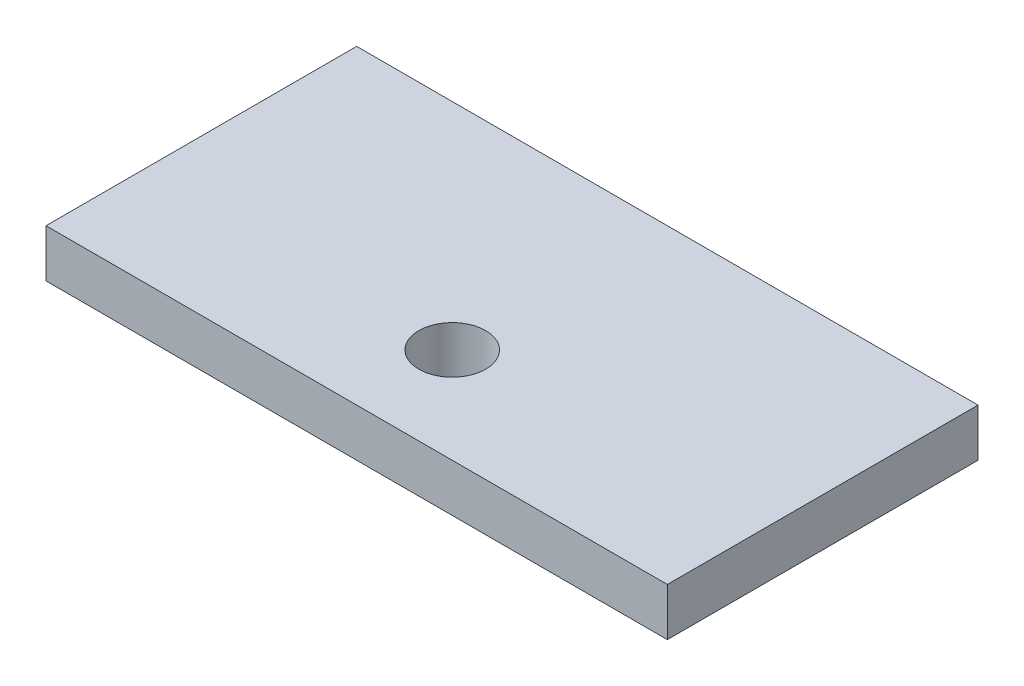
ISO-10303-21;
HEADER;
FILE_DESCRIPTION(('STEP AP214'),'2;1');
FILE_NAME('part.step','',(''),(''),'','','');
FILE_SCHEMA(('AUTOMOTIVE_DESIGN { 1 0 10303 214 1 1 1 1 }'));
ENDSEC;
DATA;
#1=APPLICATION_CONTEXT('core data for automotive mechanical design processes');
#2=APPLICATION_PROTOCOL_DEFINITION('international standard','automotive_design',2000,#1);
#3=PRODUCT_CONTEXT('',#1,'mechanical');
#4=PRODUCT('Part','Part','',(#3));
#5=PRODUCT_RELATED_PRODUCT_CATEGORY('part','',(#4));
#6=PRODUCT_DEFINITION_FORMATION('','',#4);
#7=PRODUCT_DEFINITION_CONTEXT('part definition',#1,'design');
#8=PRODUCT_DEFINITION('design','',#6,#7);
#9=PRODUCT_DEFINITION_SHAPE('','',#8);
#10=(LENGTH_UNIT() NAMED_UNIT(*) SI_UNIT(.MILLI.,.METRE.));
#11=(NAMED_UNIT(*) PLANE_ANGLE_UNIT() SI_UNIT($,.RADIAN.));
#12=(NAMED_UNIT(*) SI_UNIT($,.STERADIAN.) SOLID_ANGLE_UNIT());
#13=UNCERTAINTY_MEASURE_WITH_UNIT(LENGTH_MEASURE(1.E-05),#10,'distance_accuracy_value','');
#14=(GEOMETRIC_REPRESENTATION_CONTEXT(3) GLOBAL_UNCERTAINTY_ASSIGNED_CONTEXT((#13)) GLOBAL_UNIT_ASSIGNED_CONTEXT((#10,
#11,#12)) REPRESENTATION_CONTEXT('',''));
#15=CARTESIAN_POINT('',(0.,0.,0.));
#16=DIRECTION('',(0.,0.,1.));
#17=DIRECTION('',(1.,0.,0.));
#18=AXIS2_PLACEMENT_3D('',#15,#16,#17);
#19=CARTESIAN_POINT('',(65.,10.,32.5));
#20=DIRECTION('',(-1.,0.,0.));
#21=DIRECTION('',(0.,0.,1.));
#22=AXIS2_PLACEMENT_3D('',#19,#20,#21);
#23=PLANE('',#22);
#24=DIRECTION('',(0.,0.,-1.));
#25=VECTOR('',#24,1.);
#26=CARTESIAN_POINT('',(65.,0.,32.5));
#27=LINE('',#26,#25);
#28=CARTESIAN_POINT('',(65.,0.,32.5));
#29=VERTEX_POINT('',#28);
#30=CARTESIAN_POINT('',(65.,0.,-32.5));
#31=VERTEX_POINT('',#30);
#32=EDGE_CURVE('E99',#29,#31,#27,.T.);
#33=ORIENTED_EDGE('',*,*,#32,.T.);
#34=DIRECTION('',(0.,-1.,0.));
#35=VECTOR('',#34,1.);
#36=CARTESIAN_POINT('',(65.,10.,-32.5));
#37=LINE('',#36,#35);
#38=CARTESIAN_POINT('',(65.,10.,-32.5));
#39=VERTEX_POINT('',#38);
#40=EDGE_CURVE('E11',#39,#31,#37,.T.);
#41=ORIENTED_EDGE('',*,*,#40,.F.);
#42=DIRECTION('',(0.,0.,-1.));
#43=VECTOR('',#42,1.);
#44=CARTESIAN_POINT('',(65.,10.,32.5));
#45=LINE('',#44,#43);
#46=CARTESIAN_POINT('',(65.,10.,32.5));
#47=VERTEX_POINT('',#46);
#48=EDGE_CURVE('E86',#47,#39,#45,.T.);
#49=ORIENTED_EDGE('',*,*,#48,.F.);
#50=DIRECTION('',(0.,-1.,0.));
#51=VECTOR('',#50,1.);
#52=CARTESIAN_POINT('',(65.,10.,32.5));
#53=LINE('',#52,#51);
#54=EDGE_CURVE('E95',#47,#29,#53,.T.);
#55=ORIENTED_EDGE('',*,*,#54,.T.);
#56=EDGE_LOOP('',(#33,#41,#49,#55));
#57=FACE_BOUND('',#56,.T.);
#58=ADVANCED_FACE('F34',(#57),#23,.F.);
#59=CARTESIAN_POINT('',(-65.,10.,-32.5));
#60=DIRECTION('',(0.,0.,1.));
#61=DIRECTION('',(1.,0.,0.));
#62=AXIS2_PLACEMENT_3D('',#59,#60,#61);
#63=PLANE('',#62);
#64=DIRECTION('',(-1.,0.,0.));
#65=VECTOR('',#64,1.);
#66=CARTESIAN_POINT('',(-65.,0.,-32.5));
#67=LINE('',#66,#65);
#68=CARTESIAN_POINT('',(-65.,0.,-32.5));
#69=VERTEX_POINT('',#68);
#70=EDGE_CURVE('E90',#31,#69,#67,.T.);
#71=ORIENTED_EDGE('',*,*,#70,.T.);
#72=DIRECTION('',(0.,-1.,0.));
#73=VECTOR('',#72,1.);
#74=CARTESIAN_POINT('',(-65.,10.,-32.5));
#75=LINE('',#74,#73);
#76=CARTESIAN_POINT('',(-65.,10.,-32.5));
#77=VERTEX_POINT('',#76);
#78=EDGE_CURVE('E43',#77,#69,#75,.T.);
#79=ORIENTED_EDGE('',*,*,#78,.F.);
#80=DIRECTION('',(-1.,0.,0.));
#81=VECTOR('',#80,1.);
#82=CARTESIAN_POINT('',(-65.,10.,-32.5));
#83=LINE('',#82,#81);
#84=EDGE_CURVE('E81',#39,#77,#83,.T.);
#85=ORIENTED_EDGE('',*,*,#84,.F.);
#86=ORIENTED_EDGE('',*,*,#40,.T.);
#87=EDGE_LOOP('',(#71,#79,#85,#86));
#88=FACE_BOUND('',#87,.T.);
#89=ADVANCED_FACE('F89',(#88),#63,.F.);
#90=CARTESIAN_POINT('',(-65.,10.,32.5));
#91=DIRECTION('',(1.,0.,0.));
#92=DIRECTION('',(0.,0.,-1.));
#93=AXIS2_PLACEMENT_3D('',#90,#91,#92);
#94=PLANE('',#93);
#95=DIRECTION('',(0.,0.,1.));
#96=VECTOR('',#95,1.);
#97=CARTESIAN_POINT('',(-65.,0.,32.5));
#98=LINE('',#97,#96);
#99=CARTESIAN_POINT('',(-65.,0.,32.5));
#100=VERTEX_POINT('',#99);
#101=EDGE_CURVE('E68',#69,#100,#98,.T.);
#102=ORIENTED_EDGE('',*,*,#101,.T.);
#103=DIRECTION('',(0.,-1.,0.));
#104=VECTOR('',#103,1.);
#105=CARTESIAN_POINT('',(-65.,10.,32.5));
#106=LINE('',#105,#104);
#107=CARTESIAN_POINT('',(-65.,10.,32.5));
#108=VERTEX_POINT('',#107);
#109=EDGE_CURVE('E91',#108,#100,#106,.T.);
#110=ORIENTED_EDGE('',*,*,#109,.F.);
#111=DIRECTION('',(0.,0.,1.));
#112=VECTOR('',#111,1.);
#113=CARTESIAN_POINT('',(-65.,10.,32.5));
#114=LINE('',#113,#112);
#115=EDGE_CURVE('E84',#77,#108,#114,.T.);
#116=ORIENTED_EDGE('',*,*,#115,.F.);
#117=ORIENTED_EDGE('',*,*,#78,.T.);
#118=EDGE_LOOP('',(#102,#110,#116,#117));
#119=FACE_BOUND('',#118,.T.);
#120=ADVANCED_FACE('F93',(#119),#94,.F.);
#121=CARTESIAN_POINT('',(-65.,10.,32.5));
#122=DIRECTION('',(0.,0.,-1.));
#123=DIRECTION('',(-1.,0.,0.));
#124=AXIS2_PLACEMENT_3D('',#121,#122,#123);
#125=PLANE('',#124);
#126=DIRECTION('',(1.,0.,0.));
#127=VECTOR('',#126,1.);
#128=CARTESIAN_POINT('',(-65.,0.,32.5));
#129=LINE('',#128,#127);
#130=EDGE_CURVE('E74',#100,#29,#129,.T.);
#131=ORIENTED_EDGE('',*,*,#130,.T.);
#132=ORIENTED_EDGE('',*,*,#54,.F.);
#133=DIRECTION('',(1.,0.,0.));
#134=VECTOR('',#133,1.);
#135=CARTESIAN_POINT('',(-65.,10.,32.5));
#136=LINE('',#135,#134);
#137=EDGE_CURVE('E51',#108,#47,#136,.T.);
#138=ORIENTED_EDGE('',*,*,#137,.F.);
#139=ORIENTED_EDGE('',*,*,#109,.T.);
#140=EDGE_LOOP('',(#131,#132,#138,#139));
#141=FACE_BOUND('',#140,.T.);
#142=ADVANCED_FACE('F106',(#141),#125,.F.);
#143=CARTESIAN_POINT('',(0.,10.,0.));
#144=DIRECTION('',(0.,-1.,0.));
#145=DIRECTION('',(0.,0.,-1.));
#146=AXIS2_PLACEMENT_3D('',#143,#144,#145);
#147=PLANE('',#146);
#148=CARTESIAN_POINT('',(0.,10.,12.5));
#149=DIRECTION('',(0.,1.,0.));
#150=DIRECTION('',(0.,0.,1.));
#151=AXIS2_PLACEMENT_3D('',#148,#149,#150);
#152=CIRCLE('',#151,7.);
#153=CARTESIAN_POINT('',(0.,10.,19.5));
#154=VERTEX_POINT('',#153);
#155=EDGE_CURVE('E112',#154,#154,#152,.T.);
#156=ORIENTED_EDGE('',*,*,#155,.F.);
#157=EDGE_LOOP('',(#156));
#158=FACE_BOUND('',#157,.T.);
#159=ORIENTED_EDGE('',*,*,#48,.T.);
#160=ORIENTED_EDGE('',*,*,#84,.T.);
#161=ORIENTED_EDGE('',*,*,#115,.T.);
#162=ORIENTED_EDGE('',*,*,#137,.T.);
#163=EDGE_LOOP('',(#159,#160,#161,#162));
#164=FACE_BOUND('',#163,.T.);
#165=ADVANCED_FACE('F82',(#158,#164),#147,.F.);
#166=CARTESIAN_POINT('',(0.,0.,0.));
#167=DIRECTION('',(0.,-1.,0.));
#168=DIRECTION('',(0.,0.,-1.));
#169=AXIS2_PLACEMENT_3D('',#166,#167,#168);
#170=PLANE('',#169);
#171=CARTESIAN_POINT('',(0.,0.,12.5));
#172=DIRECTION('',(0.,-1.,0.));
#173=DIRECTION('',(0.,0.,-1.));
#174=AXIS2_PLACEMENT_3D('',#171,#172,#173);
#175=CIRCLE('',#174,7.);
#176=CARTESIAN_POINT('',(0.,0.,19.5));
#177=VERTEX_POINT('',#176);
#178=EDGE_CURVE('E37',#177,#177,#175,.T.);
#179=ORIENTED_EDGE('',*,*,#178,.F.);
#180=EDGE_LOOP('',(#179));
#181=FACE_BOUND('',#180,.T.);
#182=ORIENTED_EDGE('',*,*,#32,.F.);
#183=ORIENTED_EDGE('',*,*,#130,.F.);
#184=ORIENTED_EDGE('',*,*,#101,.F.);
#185=ORIENTED_EDGE('',*,*,#70,.F.);
#186=EDGE_LOOP('',(#182,#183,#184,#185));
#187=FACE_BOUND('',#186,.T.);
#188=ADVANCED_FACE('F109',(#181,#187),#170,.T.);
#189=CARTESIAN_POINT('',(0.,-1.2E-05,12.5));
#190=DIRECTION('',(0.,1.,0.));
#191=DIRECTION('',(0.,0.,1.));
#192=AXIS2_PLACEMENT_3D('',#189,#190,#191);
#193=CYLINDRICAL_SURFACE('',#192,7.);
#194=CARTESIAN_POINT('',(0.,0.,19.5));
#195=CARTESIAN_POINT('',(0.,0.104166666666667,19.5));
#196=CARTESIAN_POINT('',(0.,0.208333333333333,19.5));
#197=CARTESIAN_POINT('',(0.,0.416666666666667,19.5));
#198=CARTESIAN_POINT('',(0.,0.520833333333333,19.5));
#199=CARTESIAN_POINT('',(0.,0.729166666666667,19.5));
#200=CARTESIAN_POINT('',(0.,0.833333333333333,19.5));
#201=CARTESIAN_POINT('',(0.,1.04166666666667,19.5));
#202=CARTESIAN_POINT('',(0.,1.14583333333333,19.5));
#203=CARTESIAN_POINT('',(0.,1.35416666666667,19.5));
#204=CARTESIAN_POINT('',(0.,1.45833333333333,19.5));
#205=CARTESIAN_POINT('',(0.,1.66666666666667,19.5));
#206=CARTESIAN_POINT('',(0.,1.77083333333333,19.5));
#207=CARTESIAN_POINT('',(0.,1.97916666666667,19.5));
#208=CARTESIAN_POINT('',(0.,2.08333333333333,19.5));
#209=CARTESIAN_POINT('',(0.,2.29166666666667,19.5));
#210=CARTESIAN_POINT('',(0.,2.39583333333333,19.5));
#211=CARTESIAN_POINT('',(0.,2.60416666666667,19.5));
#212=CARTESIAN_POINT('',(0.,2.70833333333333,19.5));
#213=CARTESIAN_POINT('',(0.,2.91666666666667,19.5));
#214=CARTESIAN_POINT('',(0.,3.02083333333333,19.5));
#215=CARTESIAN_POINT('',(0.,3.22916666666667,19.5));
#216=CARTESIAN_POINT('',(0.,3.33333333333333,19.5));
#217=CARTESIAN_POINT('',(0.,3.54166666666667,19.5));
#218=CARTESIAN_POINT('',(0.,3.64583333333333,19.5));
#219=CARTESIAN_POINT('',(0.,3.85416666666667,19.5));
#220=CARTESIAN_POINT('',(0.,3.95833333333333,19.5));
#221=CARTESIAN_POINT('',(0.,4.16666666666667,19.5));
#222=CARTESIAN_POINT('',(0.,4.27083333333333,19.5));
#223=CARTESIAN_POINT('',(0.,4.47916666666667,19.5));
#224=CARTESIAN_POINT('',(0.,4.58333333333333,19.5));
#225=CARTESIAN_POINT('',(0.,4.79166666666667,19.5));
#226=CARTESIAN_POINT('',(0.,4.89583333333333,19.5));
#227=CARTESIAN_POINT('',(0.,5.10416666666667,19.5));
#228=CARTESIAN_POINT('',(0.,5.20833333333333,19.5));
#229=CARTESIAN_POINT('',(0.,5.41666666666667,19.5));
#230=CARTESIAN_POINT('',(0.,5.52083333333333,19.5));
#231=CARTESIAN_POINT('',(0.,5.72916666666667,19.5));
#232=CARTESIAN_POINT('',(0.,5.83333333333333,19.5));
#233=CARTESIAN_POINT('',(0.,6.04166666666667,19.5));
#234=CARTESIAN_POINT('',(0.,6.14583333333333,19.5));
#235=CARTESIAN_POINT('',(0.,6.35416666666667,19.5));
#236=CARTESIAN_POINT('',(0.,6.45833333333333,19.5));
#237=CARTESIAN_POINT('',(0.,6.66666666666667,19.5));
#238=CARTESIAN_POINT('',(0.,6.77083333333333,19.5));
#239=CARTESIAN_POINT('',(0.,6.97916666666667,19.5));
#240=CARTESIAN_POINT('',(0.,7.08333333333333,19.5));
#241=CARTESIAN_POINT('',(0.,7.29166666666667,19.5));
#242=CARTESIAN_POINT('',(0.,7.39583333333333,19.5));
#243=CARTESIAN_POINT('',(0.,7.60416666666667,19.5));
#244=CARTESIAN_POINT('',(0.,7.70833333333333,19.5));
#245=CARTESIAN_POINT('',(0.,7.91666666666667,19.5));
#246=CARTESIAN_POINT('',(0.,8.02083333333333,19.5));
#247=CARTESIAN_POINT('',(0.,8.22916666666667,19.5));
#248=CARTESIAN_POINT('',(0.,8.33333333333333,19.5));
#249=CARTESIAN_POINT('',(0.,8.54166666666667,19.5));
#250=CARTESIAN_POINT('',(0.,8.64583333333333,19.5));
#251=CARTESIAN_POINT('',(0.,8.85416666666667,19.5));
#252=CARTESIAN_POINT('',(0.,8.95833333333333,19.5));
#253=CARTESIAN_POINT('',(0.,9.16666666666667,19.5));
#254=CARTESIAN_POINT('',(0.,9.27083333333333,19.5));
#255=CARTESIAN_POINT('',(0.,9.47916666666667,19.5));
#256=CARTESIAN_POINT('',(0.,9.58333333333333,19.5));
#257=CARTESIAN_POINT('',(0.,9.79166666666667,19.5));
#258=CARTESIAN_POINT('',(0.,9.89583333333333,19.5));
#259=CARTESIAN_POINT('',(0.,10.,19.5));
#260=B_SPLINE_CURVE_WITH_KNOTS('',3,(#194,#195,#196,#197,#198,#199,#200,#201,#202,#203,#204,
#205,#206,#207,#208,#209,#210,#211,#212,#213,#214,#215,#216,#217,#218,#219,#220,#221,#222,#223,
#224,#225,#226,#227,#228,#229,#230,#231,#232,#233,#234,#235,#236,#237,#238,#239,#240,#241,#242,
#243,#244,#245,#246,#247,#248,#249,#250,#251,#252,#253,#254,#255,#256,#257,#258,#259),
.UNSPECIFIED.,.F.,.F.,(4,2,2,2,2,2,2,2,2,2,2,2,2,2,2,2,2,2,2,2,2,2,2,2,2,2,2,2,2,2,2,2,4),(0.,
0.3125,0.625,0.9375,1.25,1.5625,1.875,2.1875,2.5,2.8125,3.125,3.4375,3.75,4.0625,4.375,4.6875,
5.,5.3125,5.625,5.9375,6.25,6.5625,6.875,7.1875,7.5,7.8125,8.125,8.4375,8.75,9.0625,9.375,
9.6875,10.),.UNSPECIFIED.);
#261=EDGE_CURVE('BSEAM119',#177,#154,#260,.T.);
#262=ORIENTED_EDGE('',*,*,#178,.T.);
#263=ORIENTED_EDGE('',*,*,#155,.T.);
#264=ORIENTED_EDGE('',*,*,#261,.T.);
#265=ORIENTED_EDGE('',*,*,#261,.F.);
#266=EDGE_LOOP('',(#262,#264,#263,#265));
#267=FACE_BOUND('',#266,.T.);
#268=ADVANCED_FACE('F119',(#267),#193,.F.);
#269=CLOSED_SHELL('',(#58,#89,#120,#142,#165,#188,#268));
#270=MANIFOLD_SOLID_BREP('B2',#269);
#271=ADVANCED_BREP_SHAPE_REPRESENTATION('',(#18,#270),#14);
#272=SHAPE_DEFINITION_REPRESENTATION(#9,#271);
ENDSEC;
END-ISO-10303-21;
